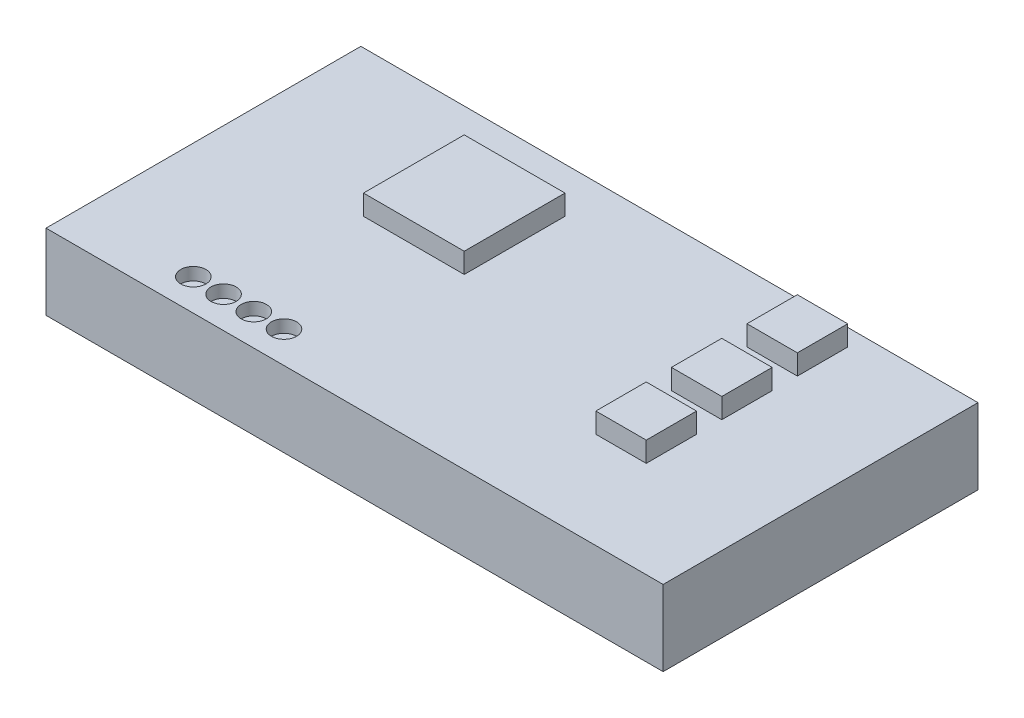
ISO-10303-21;
HEADER;
FILE_DESCRIPTION(('STEP AP214'),'2;1');
FILE_NAME('part.step','',(''),(''),'','','');
FILE_SCHEMA(('AUTOMOTIVE_DESIGN { 1 0 10303 214 1 1 1 1 }'));
ENDSEC;
DATA;
#1=APPLICATION_CONTEXT('core data for automotive mechanical design processes');
#2=APPLICATION_PROTOCOL_DEFINITION('international standard','automotive_design',2000,#1);
#3=PRODUCT_CONTEXT('',#1,'mechanical');
#4=PRODUCT('Part','Part','',(#3));
#5=PRODUCT_RELATED_PRODUCT_CATEGORY('part','',(#4));
#6=PRODUCT_DEFINITION_FORMATION('','',#4);
#7=PRODUCT_DEFINITION_CONTEXT('part definition',#1,'design');
#8=PRODUCT_DEFINITION('design','',#6,#7);
#9=PRODUCT_DEFINITION_SHAPE('','',#8);
#10=(LENGTH_UNIT() NAMED_UNIT(*) SI_UNIT(.MILLI.,.METRE.));
#11=(NAMED_UNIT(*) PLANE_ANGLE_UNIT() SI_UNIT($,.RADIAN.));
#12=(NAMED_UNIT(*) SI_UNIT($,.STERADIAN.) SOLID_ANGLE_UNIT());
#13=UNCERTAINTY_MEASURE_WITH_UNIT(LENGTH_MEASURE(1.E-05),#10,'distance_accuracy_value','');
#14=(GEOMETRIC_REPRESENTATION_CONTEXT(3) GLOBAL_UNCERTAINTY_ASSIGNED_CONTEXT((#13)) GLOBAL_UNIT_ASSIGNED_CONTEXT((#10,
#11,#12)) REPRESENTATION_CONTEXT('',''));
#15=CARTESIAN_POINT('',(0.,0.,0.));
#16=DIRECTION('',(0.,0.,1.));
#17=DIRECTION('',(1.,0.,0.));
#18=AXIS2_PLACEMENT_3D('',#15,#16,#17);
#19=CARTESIAN_POINT('',(0.,3.,0.));
#20=DIRECTION('',(0.,1.,0.));
#21=DIRECTION('',(0.,0.,1.));
#22=AXIS2_PLACEMENT_3D('',#19,#20,#21);
#23=PLANE('',#22);
#24=CARTESIAN_POINT('',(-6.45486952116644,3.,4.99629776021628));
#25=DIRECTION('',(0.,1.,0.));
#26=DIRECTION('',(0.,0.,1.));
#27=AXIS2_PLACEMENT_3D('',#24,#25,#26);
#28=CIRCLE('',#27,0.500000000000002);
#29=CARTESIAN_POINT('',(-6.45486952116644,3.,5.49629776021629));
#30=VERTEX_POINT('',#29);
#31=EDGE_CURVE('E290',#30,#30,#28,.T.);
#32=ORIENTED_EDGE('',*,*,#31,.F.);
#33=EDGE_LOOP('',(#32));
#34=FACE_BOUND('',#33,.T.);
#35=CARTESIAN_POINT('',(-5.25486952116644,3.,4.99629776021628));
#36=DIRECTION('',(0.,1.,0.));
#37=DIRECTION('',(0.,0.,1.));
#38=AXIS2_PLACEMENT_3D('',#35,#36,#37);
#39=CIRCLE('',#38,0.500000000000001);
#40=CARTESIAN_POINT('',(-5.25486952116644,3.,5.49629776021629));
#41=VERTEX_POINT('',#40);
#42=EDGE_CURVE('E296',#41,#41,#39,.T.);
#43=ORIENTED_EDGE('',*,*,#42,.F.);
#44=EDGE_LOOP('',(#43));
#45=FACE_BOUND('',#44,.T.);
#46=CARTESIAN_POINT('',(-4.05486952116644,3.,4.99629776021628));
#47=DIRECTION('',(0.,1.,0.));
#48=DIRECTION('',(0.,0.,1.));
#49=AXIS2_PLACEMENT_3D('',#46,#47,#48);
#50=CIRCLE('',#49,0.500000000000001);
#51=CARTESIAN_POINT('',(-4.05486952116644,3.,5.49629776021629));
#52=VERTEX_POINT('',#51);
#53=EDGE_CURVE('E285',#52,#52,#50,.T.);
#54=ORIENTED_EDGE('',*,*,#53,.F.);
#55=EDGE_LOOP('',(#54));
#56=FACE_BOUND('',#55,.T.);
#57=CARTESIAN_POINT('',(-7.65486952116644,3.,4.99629776021628));
#58=DIRECTION('',(0.,1.,0.));
#59=DIRECTION('',(0.,0.,1.));
#60=AXIS2_PLACEMENT_3D('',#57,#58,#59);
#61=CIRCLE('',#60,0.500000000000001);
#62=CARTESIAN_POINT('',(-7.65486952116644,3.,5.49629776021629));
#63=VERTEX_POINT('',#62);
#64=EDGE_CURVE('E289',#63,#63,#61,.T.);
#65=ORIENTED_EDGE('',*,*,#64,.F.);
#66=EDGE_LOOP('',(#65));
#67=FACE_BOUND('',#66,.T.);
#68=DIRECTION('',(0.,0.,-1.));
#69=VECTOR('',#68,1.);
#70=CARTESIAN_POINT('',(12.25,3.,-6.25));
#71=LINE('',#70,#69);
#72=CARTESIAN_POINT('',(12.25,3.,6.25));
#73=VERTEX_POINT('',#72);
#74=CARTESIAN_POINT('',(12.25,3.,-6.25));
#75=VERTEX_POINT('',#74);
#76=EDGE_CURVE('E310',#73,#75,#71,.T.);
#77=ORIENTED_EDGE('',*,*,#76,.T.);
#78=DIRECTION('',(-1.,0.,0.));
#79=VECTOR('',#78,1.);
#80=CARTESIAN_POINT('',(-12.25,3.,-6.25));
#81=LINE('',#80,#79);
#82=CARTESIAN_POINT('',(-12.25,3.,-6.25));
#83=VERTEX_POINT('',#82);
#84=EDGE_CURVE('E313',#75,#83,#81,.T.);
#85=ORIENTED_EDGE('',*,*,#84,.T.);
#86=DIRECTION('',(0.,0.,1.));
#87=VECTOR('',#86,1.);
#88=CARTESIAN_POINT('',(-12.25,3.,-6.25));
#89=LINE('',#88,#87);
#90=CARTESIAN_POINT('',(-12.25,3.,6.25));
#91=VERTEX_POINT('',#90);
#92=EDGE_CURVE('E316',#83,#91,#89,.T.);
#93=ORIENTED_EDGE('',*,*,#92,.T.);
#94=DIRECTION('',(1.,0.,0.));
#95=VECTOR('',#94,1.);
#96=CARTESIAN_POINT('',(-12.25,3.,6.25));
#97=LINE('',#96,#95);
#98=EDGE_CURVE('E318',#91,#73,#97,.T.);
#99=ORIENTED_EDGE('',*,*,#98,.T.);
#100=EDGE_LOOP('',(#77,#85,#93,#99));
#101=FACE_BOUND('',#100,.T.);
#102=DIRECTION('',(-1.,0.,0.));
#103=VECTOR('',#102,1.);
#104=CARTESIAN_POINT('',(-6.35384151580184,3.,-4.45761794479129));
#105=LINE('',#104,#103);
#106=CARTESIAN_POINT('',(-2.35384151580184,3.,-4.45761794479129));
#107=VERTEX_POINT('',#106);
#108=CARTESIAN_POINT('',(-6.35384151580184,3.,-4.45761794479129));
#109=VERTEX_POINT('',#108);
#110=EDGE_CURVE('E270',#107,#109,#105,.T.);
#111=ORIENTED_EDGE('',*,*,#110,.F.);
#112=DIRECTION('',(0.,0.,-1.));
#113=VECTOR('',#112,1.);
#114=CARTESIAN_POINT('',(-2.35384151580184,3.,-4.45761794479129));
#115=LINE('',#114,#113);
#116=CARTESIAN_POINT('',(-2.35384151580184,3.,-0.457617944791294));
#117=VERTEX_POINT('',#116);
#118=EDGE_CURVE('E256',#117,#107,#115,.T.);
#119=ORIENTED_EDGE('',*,*,#118,.F.);
#120=DIRECTION('',(1.,0.,0.));
#121=VECTOR('',#120,1.);
#122=CARTESIAN_POINT('',(-6.35384151580184,3.,-0.457617944791294));
#123=LINE('',#122,#121);
#124=CARTESIAN_POINT('',(-6.35384151580184,3.,-0.457617944791294));
#125=VERTEX_POINT('',#124);
#126=EDGE_CURVE('E261',#125,#117,#123,.T.);
#127=ORIENTED_EDGE('',*,*,#126,.F.);
#128=DIRECTION('',(0.,0.,1.));
#129=VECTOR('',#128,1.);
#130=CARTESIAN_POINT('',(-6.35384151580184,3.,-4.45761794479129));
#131=LINE('',#130,#129);
#132=EDGE_CURVE('E272',#109,#125,#131,.T.);
#133=ORIENTED_EDGE('',*,*,#132,.F.);
#134=EDGE_LOOP('',(#111,#119,#127,#133));
#135=FACE_BOUND('',#134,.T.);
#136=DIRECTION('',(-1.,0.,0.));
#137=VECTOR('',#136,1.);
#138=CARTESIAN_POINT('',(5.75248587462615,3.,-5.57459680159975));
#139=LINE('',#138,#137);
#140=CARTESIAN_POINT('',(7.75248587462615,3.,-5.57459680159975));
#141=VERTEX_POINT('',#140);
#142=CARTESIAN_POINT('',(5.75248587462615,3.,-5.57459680159975));
#143=VERTEX_POINT('',#142);
#144=EDGE_CURVE('E241',#141,#143,#139,.T.);
#145=ORIENTED_EDGE('',*,*,#144,.F.);
#146=DIRECTION('',(0.,0.,-1.));
#147=VECTOR('',#146,1.);
#148=CARTESIAN_POINT('',(7.75248587462615,3.,-5.57459680159975));
#149=LINE('',#148,#147);
#150=CARTESIAN_POINT('',(7.75248587462615,3.,-3.57653343185074));
#151=VERTEX_POINT('',#150);
#152=EDGE_CURVE('E227',#151,#141,#149,.T.);
#153=ORIENTED_EDGE('',*,*,#152,.F.);
#154=DIRECTION('',(1.,0.,0.));
#155=VECTOR('',#154,1.);
#156=CARTESIAN_POINT('',(5.75248587462615,3.,-3.57653343185074));
#157=LINE('',#156,#155);
#158=CARTESIAN_POINT('',(5.75248587462615,3.,-3.57653343185074));
#159=VERTEX_POINT('',#158);
#160=EDGE_CURVE('E232',#159,#151,#157,.T.);
#161=ORIENTED_EDGE('',*,*,#160,.F.);
#162=DIRECTION('',(0.,0.,1.));
#163=VECTOR('',#162,1.);
#164=CARTESIAN_POINT('',(5.75248587462615,3.,-5.57459680159975));
#165=LINE('',#164,#163);
#166=EDGE_CURVE('E243',#143,#159,#165,.T.);
#167=ORIENTED_EDGE('',*,*,#166,.F.);
#168=EDGE_LOOP('',(#145,#153,#161,#167));
#169=FACE_BOUND('',#168,.T.);
#170=DIRECTION('',(-1.,0.,0.));
#171=VECTOR('',#170,1.);
#172=CARTESIAN_POINT('',(5.75248587462618,3.,-2.57459680159975));
#173=LINE('',#172,#171);
#174=CARTESIAN_POINT('',(7.75248587462618,3.,-2.57459680159975));
#175=VERTEX_POINT('',#174);
#176=CARTESIAN_POINT('',(5.75248587462618,3.,-2.57459680159975));
#177=VERTEX_POINT('',#176);
#178=EDGE_CURVE('E199',#175,#177,#173,.T.);
#179=ORIENTED_EDGE('',*,*,#178,.F.);
#180=DIRECTION('',(0.,0.,-1.));
#181=VECTOR('',#180,1.);
#182=CARTESIAN_POINT('',(7.75248587462618,3.,-2.57459680159975));
#183=LINE('',#182,#181);
#184=CARTESIAN_POINT('',(7.75248587462618,3.,-0.576533431850738));
#185=VERTEX_POINT('',#184);
#186=EDGE_CURVE('E196',#185,#175,#183,.T.);
#187=ORIENTED_EDGE('',*,*,#186,.F.);
#188=DIRECTION('',(1.,0.,0.));
#189=VECTOR('',#188,1.);
#190=CARTESIAN_POINT('',(5.75248587462618,3.,-0.576533431850738));
#191=LINE('',#190,#189);
#192=CARTESIAN_POINT('',(5.75248587462618,3.,-0.576533431850738));
#193=VERTEX_POINT('',#192);
#194=EDGE_CURVE('E208',#193,#185,#191,.T.);
#195=ORIENTED_EDGE('',*,*,#194,.F.);
#196=DIRECTION('',(0.,0.,1.));
#197=VECTOR('',#196,1.);
#198=CARTESIAN_POINT('',(5.75248587462618,3.,-2.57459680159975));
#199=LINE('',#198,#197);
#200=EDGE_CURVE('E216',#177,#193,#199,.T.);
#201=ORIENTED_EDGE('',*,*,#200,.F.);
#202=EDGE_LOOP('',(#179,#187,#195,#201));
#203=FACE_BOUND('',#202,.T.);
#204=DIRECTION('',(-1.,0.,0.));
#205=VECTOR('',#204,1.);
#206=CARTESIAN_POINT('',(5.75248587462622,3.,0.425403198400254));
#207=LINE('',#206,#205);
#208=CARTESIAN_POINT('',(7.75248587462622,3.,0.425403198400254));
#209=VERTEX_POINT('',#208);
#210=CARTESIAN_POINT('',(5.75248587462622,3.,0.425403198400254));
#211=VERTEX_POINT('',#210);
#212=EDGE_CURVE('E682',#209,#211,#207,.T.);
#213=ORIENTED_EDGE('',*,*,#212,.F.);
#214=DIRECTION('',(0.,0.,-1.));
#215=VECTOR('',#214,1.);
#216=CARTESIAN_POINT('',(7.75248587462622,3.,0.425403198400254));
#217=LINE('',#216,#215);
#218=CARTESIAN_POINT('',(7.75248587462622,3.,2.42346656814926));
#219=VERTEX_POINT('',#218);
#220=EDGE_CURVE('E194',#219,#209,#217,.T.);
#221=ORIENTED_EDGE('',*,*,#220,.F.);
#222=DIRECTION('',(1.,0.,0.));
#223=VECTOR('',#222,1.);
#224=CARTESIAN_POINT('',(5.75248587462622,3.,2.42346656814926));
#225=LINE('',#224,#223);
#226=CARTESIAN_POINT('',(5.75248587462622,3.,2.42346656814926));
#227=VERTEX_POINT('',#226);
#228=EDGE_CURVE('E190',#227,#219,#225,.T.);
#229=ORIENTED_EDGE('',*,*,#228,.F.);
#230=DIRECTION('',(0.,0.,1.));
#231=VECTOR('',#230,1.);
#232=CARTESIAN_POINT('',(5.75248587462622,3.,0.425403198400254));
#233=LINE('',#232,#231);
#234=EDGE_CURVE('E679',#211,#227,#233,.T.);
#235=ORIENTED_EDGE('',*,*,#234,.F.);
#236=EDGE_LOOP('',(#213,#221,#229,#235));
#237=FACE_BOUND('',#236,.T.);
#238=ADVANCED_FACE('F33',(#34,#45,#56,#67,#101,#135,#169,#203,#237),#23,.T.);
#239=CARTESIAN_POINT('',(12.25,3.,-6.25));
#240=DIRECTION('',(-1.,0.,0.));
#241=DIRECTION('',(0.,0.,1.));
#242=AXIS2_PLACEMENT_3D('',#239,#240,#241);
#243=PLANE('',#242);
#244=DIRECTION('',(0.,0.,-1.));
#245=VECTOR('',#244,1.);
#246=CARTESIAN_POINT('',(12.25,0.,-6.25));
#247=LINE('',#246,#245);
#248=CARTESIAN_POINT('',(12.25,0.,6.25));
#249=VERTEX_POINT('',#248);
#250=CARTESIAN_POINT('',(12.25,0.,-6.25));
#251=VERTEX_POINT('',#250);
#252=EDGE_CURVE('E307',#249,#251,#247,.T.);
#253=ORIENTED_EDGE('',*,*,#252,.T.);
#254=DIRECTION('',(0.,-1.,0.));
#255=VECTOR('',#254,1.);
#256=CARTESIAN_POINT('',(12.25,3.,-6.25));
#257=LINE('',#256,#255);
#258=EDGE_CURVE('E11',#75,#251,#257,.T.);
#259=ORIENTED_EDGE('',*,*,#258,.F.);
#260=ORIENTED_EDGE('',*,*,#76,.F.);
#261=DIRECTION('',(0.,-1.,0.));
#262=VECTOR('',#261,1.);
#263=CARTESIAN_POINT('',(12.25,3.,6.25));
#264=LINE('',#263,#262);
#265=EDGE_CURVE('E320',#73,#249,#264,.T.);
#266=ORIENTED_EDGE('',*,*,#265,.T.);
#267=EDGE_LOOP('',(#253,#259,#260,#266));
#268=FACE_BOUND('',#267,.T.);
#269=ADVANCED_FACE('F35',(#268),#243,.F.);
#270=CARTESIAN_POINT('',(-12.25,3.,-6.25));
#271=DIRECTION('',(0.,0.,1.));
#272=DIRECTION('',(1.,0.,0.));
#273=AXIS2_PLACEMENT_3D('',#270,#271,#272);
#274=PLANE('',#273);
#275=DIRECTION('',(-1.,0.,0.));
#276=VECTOR('',#275,1.);
#277=CARTESIAN_POINT('',(-12.25,0.,-6.25));
#278=LINE('',#277,#276);
#279=CARTESIAN_POINT('',(-12.25,0.,-6.25));
#280=VERTEX_POINT('',#279);
#281=EDGE_CURVE('E323',#251,#280,#278,.T.);
#282=ORIENTED_EDGE('',*,*,#281,.T.);
#283=DIRECTION('',(0.,-1.,0.));
#284=VECTOR('',#283,1.);
#285=CARTESIAN_POINT('',(-12.25,3.,-6.25));
#286=LINE('',#285,#284);
#287=EDGE_CURVE('E41',#83,#280,#286,.T.);
#288=ORIENTED_EDGE('',*,*,#287,.F.);
#289=ORIENTED_EDGE('',*,*,#84,.F.);
#290=ORIENTED_EDGE('',*,*,#258,.T.);
#291=EDGE_LOOP('',(#282,#288,#289,#290));
#292=FACE_BOUND('',#291,.T.);
#293=ADVANCED_FACE('F353',(#292),#274,.F.);
#294=CARTESIAN_POINT('',(-12.25,3.,-6.25));
#295=DIRECTION('',(1.,0.,0.));
#296=DIRECTION('',(0.,0.,-1.));
#297=AXIS2_PLACEMENT_3D('',#294,#295,#296);
#298=PLANE('',#297);
#299=DIRECTION('',(0.,0.,1.));
#300=VECTOR('',#299,1.);
#301=CARTESIAN_POINT('',(-12.25,0.,-6.25));
#302=LINE('',#301,#300);
#303=CARTESIAN_POINT('',(-12.25,0.,6.25));
#304=VERTEX_POINT('',#303);
#305=EDGE_CURVE('E325',#280,#304,#302,.T.);
#306=ORIENTED_EDGE('',*,*,#305,.T.);
#307=DIRECTION('',(0.,-1.,0.));
#308=VECTOR('',#307,1.);
#309=CARTESIAN_POINT('',(-12.25,3.,6.25));
#310=LINE('',#309,#308);
#311=EDGE_CURVE('E330',#91,#304,#310,.T.);
#312=ORIENTED_EDGE('',*,*,#311,.F.);
#313=ORIENTED_EDGE('',*,*,#92,.F.);
#314=ORIENTED_EDGE('',*,*,#287,.T.);
#315=EDGE_LOOP('',(#306,#312,#313,#314));
#316=FACE_BOUND('',#315,.T.);
#317=ADVANCED_FACE('F337',(#316),#298,.F.);
#318=CARTESIAN_POINT('',(-12.25,3.,6.25));
#319=DIRECTION('',(0.,0.,-1.));
#320=DIRECTION('',(-1.,0.,0.));
#321=AXIS2_PLACEMENT_3D('',#318,#319,#320);
#322=PLANE('',#321);
#323=DIRECTION('',(1.,0.,0.));
#324=VECTOR('',#323,1.);
#325=CARTESIAN_POINT('',(-12.25,0.,6.25));
#326=LINE('',#325,#324);
#327=EDGE_CURVE('E314',#304,#249,#326,.T.);
#328=ORIENTED_EDGE('',*,*,#327,.T.);
#329=ORIENTED_EDGE('',*,*,#265,.F.);
#330=ORIENTED_EDGE('',*,*,#98,.F.);
#331=ORIENTED_EDGE('',*,*,#311,.T.);
#332=EDGE_LOOP('',(#328,#329,#330,#331));
#333=FACE_BOUND('',#332,.T.);
#334=ADVANCED_FACE('F346',(#333),#322,.F.);
#335=CARTESIAN_POINT('',(0.,0.,0.));
#336=DIRECTION('',(0.,1.,0.));
#337=DIRECTION('',(0.,0.,1.));
#338=AXIS2_PLACEMENT_3D('',#335,#336,#337);
#339=PLANE('',#338);
#340=ORIENTED_EDGE('',*,*,#252,.F.);
#341=ORIENTED_EDGE('',*,*,#327,.F.);
#342=ORIENTED_EDGE('',*,*,#305,.F.);
#343=ORIENTED_EDGE('',*,*,#281,.F.);
#344=EDGE_LOOP('',(#340,#341,#342,#343));
#345=FACE_BOUND('',#344,.T.);
#346=ADVANCED_FACE('F343',(#345),#339,.F.);
#347=CARTESIAN_POINT('',(-7.65486952116644,2.5,4.99629776021628));
#348=DIRECTION('',(0.,1.,0.));
#349=DIRECTION('',(0.,0.,1.));
#350=AXIS2_PLACEMENT_3D('',#347,#348,#349);
#351=CYLINDRICAL_SURFACE('',#350,0.500000000000001);
#352=CARTESIAN_POINT('',(-7.65486952116644,2.5,4.99629776021628));
#353=DIRECTION('',(0.,1.,0.));
#354=DIRECTION('',(0.,0.,1.));
#355=AXIS2_PLACEMENT_3D('',#352,#353,#354);
#356=CIRCLE('',#355,0.500000000000001);
#357=CARTESIAN_POINT('',(-7.65486952116644,2.5,5.49629776021629));
#358=VERTEX_POINT('',#357);
#359=EDGE_CURVE('E304',#358,#358,#356,.T.);
#360=ORIENTED_EDGE('',*,*,#359,.F.);
#361=EDGE_LOOP('',(#360));
#362=FACE_BOUND('',#361,.T.);
#363=ORIENTED_EDGE('',*,*,#64,.T.);
#364=EDGE_LOOP('',(#363));
#365=FACE_BOUND('',#364,.T.);
#366=ADVANCED_FACE('F369',(#362,#365),#351,.F.);
#367=CARTESIAN_POINT('',(-7.65486952116644,2.5,4.99629776021628));
#368=DIRECTION('',(0.,1.,0.));
#369=DIRECTION('',(0.,0.,1.));
#370=AXIS2_PLACEMENT_3D('',#367,#368,#369);
#371=PLANE('',#370);
#372=ORIENTED_EDGE('',*,*,#359,.T.);
#373=EDGE_LOOP('',(#372));
#374=FACE_BOUND('',#373,.T.);
#375=ADVANCED_FACE('F388',(#374),#371,.T.);
#376=CARTESIAN_POINT('',(-4.05486952116644,2.5,4.99629776021628));
#377=DIRECTION('',(0.,1.,0.));
#378=DIRECTION('',(0.,0.,1.));
#379=AXIS2_PLACEMENT_3D('',#376,#377,#378);
#380=CYLINDRICAL_SURFACE('',#379,0.500000000000001);
#381=CARTESIAN_POINT('',(-4.05486952116644,2.5,4.99629776021628));
#382=DIRECTION('',(0.,1.,0.));
#383=DIRECTION('',(0.,0.,1.));
#384=AXIS2_PLACEMENT_3D('',#381,#382,#383);
#385=CIRCLE('',#384,0.500000000000001);
#386=CARTESIAN_POINT('',(-4.05486952116644,2.5,5.49629776021629));
#387=VERTEX_POINT('',#386);
#388=EDGE_CURVE('E299',#387,#387,#385,.T.);
#389=ORIENTED_EDGE('',*,*,#388,.F.);
#390=EDGE_LOOP('',(#389));
#391=FACE_BOUND('',#390,.T.);
#392=ORIENTED_EDGE('',*,*,#53,.T.);
#393=EDGE_LOOP('',(#392));
#394=FACE_BOUND('',#393,.T.);
#395=ADVANCED_FACE('F395',(#391,#394),#380,.F.);
#396=CARTESIAN_POINT('',(-4.05486952116644,2.5,4.99629776021628));
#397=DIRECTION('',(0.,1.,0.));
#398=DIRECTION('',(0.,0.,1.));
#399=AXIS2_PLACEMENT_3D('',#396,#397,#398);
#400=PLANE('',#399);
#401=ORIENTED_EDGE('',*,*,#388,.T.);
#402=EDGE_LOOP('',(#401));
#403=FACE_BOUND('',#402,.T.);
#404=ADVANCED_FACE('F402',(#403),#400,.T.);
#405=CARTESIAN_POINT('',(-5.25486952116644,2.5,4.99629776021628));
#406=DIRECTION('',(0.,1.,0.));
#407=DIRECTION('',(0.,0.,1.));
#408=AXIS2_PLACEMENT_3D('',#405,#406,#407);
#409=CYLINDRICAL_SURFACE('',#408,0.500000000000001);
#410=CARTESIAN_POINT('',(-5.25486952116644,2.5,4.99629776021628));
#411=DIRECTION('',(0.,1.,0.));
#412=DIRECTION('',(0.,0.,1.));
#413=AXIS2_PLACEMENT_3D('',#410,#411,#412);
#414=CIRCLE('',#413,0.500000000000001);
#415=CARTESIAN_POINT('',(-5.25486952116644,2.5,5.49629776021629));
#416=VERTEX_POINT('',#415);
#417=EDGE_CURVE('E293',#416,#416,#414,.T.);
#418=ORIENTED_EDGE('',*,*,#417,.F.);
#419=EDGE_LOOP('',(#418));
#420=FACE_BOUND('',#419,.T.);
#421=ORIENTED_EDGE('',*,*,#42,.T.);
#422=EDGE_LOOP('',(#421));
#423=FACE_BOUND('',#422,.T.);
#424=ADVANCED_FACE('F410',(#420,#423),#409,.F.);
#425=CARTESIAN_POINT('',(-5.25486952116644,2.5,4.99629776021628));
#426=DIRECTION('',(0.,1.,0.));
#427=DIRECTION('',(0.,0.,1.));
#428=AXIS2_PLACEMENT_3D('',#425,#426,#427);
#429=PLANE('',#428);
#430=ORIENTED_EDGE('',*,*,#417,.T.);
#431=EDGE_LOOP('',(#430));
#432=FACE_BOUND('',#431,.T.);
#433=ADVANCED_FACE('F418',(#432),#429,.T.);
#434=CARTESIAN_POINT('',(-6.45486952116644,2.5,4.99629776021628));
#435=DIRECTION('',(0.,1.,0.));
#436=DIRECTION('',(0.,0.,1.));
#437=AXIS2_PLACEMENT_3D('',#434,#435,#436);
#438=CYLINDRICAL_SURFACE('',#437,0.500000000000002);
#439=CARTESIAN_POINT('',(-6.45486952116644,2.5,4.99629776021628));
#440=DIRECTION('',(0.,1.,0.));
#441=DIRECTION('',(0.,0.,1.));
#442=AXIS2_PLACEMENT_3D('',#439,#440,#441);
#443=CIRCLE('',#442,0.500000000000002);
#444=CARTESIAN_POINT('',(-6.45486952116644,2.5,5.49629776021629));
#445=VERTEX_POINT('',#444);
#446=EDGE_CURVE('E286',#445,#445,#443,.T.);
#447=ORIENTED_EDGE('',*,*,#446,.F.);
#448=EDGE_LOOP('',(#447));
#449=FACE_BOUND('',#448,.T.);
#450=ORIENTED_EDGE('',*,*,#31,.T.);
#451=EDGE_LOOP('',(#450));
#452=FACE_BOUND('',#451,.T.);
#453=ADVANCED_FACE('F426',(#449,#452),#438,.F.);
#454=CARTESIAN_POINT('',(-6.45486952116644,2.5,4.99629776021628));
#455=DIRECTION('',(0.,1.,0.));
#456=DIRECTION('',(0.,0.,1.));
#457=AXIS2_PLACEMENT_3D('',#454,#455,#456);
#458=PLANE('',#457);
#459=ORIENTED_EDGE('',*,*,#446,.T.);
#460=EDGE_LOOP('',(#459));
#461=FACE_BOUND('',#460,.T.);
#462=ADVANCED_FACE('F434',(#461),#458,.T.);
#463=CARTESIAN_POINT('',(-2.35384151580184,3.8,-4.45761794479129));
#464=DIRECTION('',(-1.,0.,0.));
#465=DIRECTION('',(0.,0.,1.));
#466=AXIS2_PLACEMENT_3D('',#463,#464,#465);
#467=PLANE('',#466);
#468=ORIENTED_EDGE('',*,*,#118,.T.);
#469=DIRECTION('',(0.,-1.,0.));
#470=VECTOR('',#469,1.);
#471=CARTESIAN_POINT('',(-2.35384151580184,3.8,-4.45761794479129));
#472=LINE('',#471,#470);
#473=CARTESIAN_POINT('',(-2.35384151580184,3.8,-4.45761794479129));
#474=VERTEX_POINT('',#473);
#475=EDGE_CURVE('E283',#474,#107,#472,.T.);
#476=ORIENTED_EDGE('',*,*,#475,.F.);
#477=DIRECTION('',(0.,0.,-1.));
#478=VECTOR('',#477,1.);
#479=CARTESIAN_POINT('',(-2.35384151580184,3.8,-4.45761794479129));
#480=LINE('',#479,#478);
#481=CARTESIAN_POINT('',(-2.35384151580184,3.8,-0.457617944791294));
#482=VERTEX_POINT('',#481);
#483=EDGE_CURVE('E257',#482,#474,#480,.T.);
#484=ORIENTED_EDGE('',*,*,#483,.F.);
#485=DIRECTION('',(0.,-1.,0.));
#486=VECTOR('',#485,1.);
#487=CARTESIAN_POINT('',(-2.35384151580184,3.8,-0.457617944791294));
#488=LINE('',#487,#486);
#489=EDGE_CURVE('E267',#482,#117,#488,.T.);
#490=ORIENTED_EDGE('',*,*,#489,.T.);
#491=EDGE_LOOP('',(#468,#476,#484,#490));
#492=FACE_BOUND('',#491,.T.);
#493=ADVANCED_FACE('F442',(#492),#467,.F.);
#494=CARTESIAN_POINT('',(-6.35384151580184,3.8,-4.45761794479129));
#495=DIRECTION('',(0.,0.,1.));
#496=DIRECTION('',(1.,0.,0.));
#497=AXIS2_PLACEMENT_3D('',#494,#495,#496);
#498=PLANE('',#497);
#499=ORIENTED_EDGE('',*,*,#110,.T.);
#500=DIRECTION('',(0.,-1.,0.));
#501=VECTOR('',#500,1.);
#502=CARTESIAN_POINT('',(-6.35384151580184,3.8,-4.45761794479129));
#503=LINE('',#502,#501);
#504=CARTESIAN_POINT('',(-6.35384151580184,3.8,-4.45761794479129));
#505=VERTEX_POINT('',#504);
#506=EDGE_CURVE('E280',#505,#109,#503,.T.);
#507=ORIENTED_EDGE('',*,*,#506,.F.);
#508=DIRECTION('',(-1.,0.,0.));
#509=VECTOR('',#508,1.);
#510=CARTESIAN_POINT('',(-6.35384151580184,3.8,-4.45761794479129));
#511=LINE('',#510,#509);
#512=EDGE_CURVE('E260',#474,#505,#511,.T.);
#513=ORIENTED_EDGE('',*,*,#512,.F.);
#514=ORIENTED_EDGE('',*,*,#475,.T.);
#515=EDGE_LOOP('',(#499,#507,#513,#514));
#516=FACE_BOUND('',#515,.T.);
#517=ADVANCED_FACE('F450',(#516),#498,.F.);
#518=CARTESIAN_POINT('',(-6.35384151580184,3.8,-4.45761794479129));
#519=DIRECTION('',(1.,0.,0.));
#520=DIRECTION('',(0.,0.,-1.));
#521=AXIS2_PLACEMENT_3D('',#518,#519,#520);
#522=PLANE('',#521);
#523=ORIENTED_EDGE('',*,*,#132,.T.);
#524=DIRECTION('',(0.,-1.,0.));
#525=VECTOR('',#524,1.);
#526=CARTESIAN_POINT('',(-6.35384151580184,3.8,-0.457617944791294));
#527=LINE('',#526,#525);
#528=CARTESIAN_POINT('',(-6.35384151580184,3.8,-0.457617944791294));
#529=VERTEX_POINT('',#528);
#530=EDGE_CURVE('E278',#529,#125,#527,.T.);
#531=ORIENTED_EDGE('',*,*,#530,.F.);
#532=DIRECTION('',(0.,0.,1.));
#533=VECTOR('',#532,1.);
#534=CARTESIAN_POINT('',(-6.35384151580184,3.8,-4.45761794479129));
#535=LINE('',#534,#533);
#536=EDGE_CURVE('E263',#505,#529,#535,.T.);
#537=ORIENTED_EDGE('',*,*,#536,.F.);
#538=ORIENTED_EDGE('',*,*,#506,.T.);
#539=EDGE_LOOP('',(#523,#531,#537,#538));
#540=FACE_BOUND('',#539,.T.);
#541=ADVANCED_FACE('F458',(#540),#522,.F.);
#542=CARTESIAN_POINT('',(-6.35384151580184,3.8,-0.457617944791294));
#543=DIRECTION('',(0.,0.,-1.));
#544=DIRECTION('',(-1.,0.,0.));
#545=AXIS2_PLACEMENT_3D('',#542,#543,#544);
#546=PLANE('',#545);
#547=ORIENTED_EDGE('',*,*,#126,.T.);
#548=ORIENTED_EDGE('',*,*,#489,.F.);
#549=DIRECTION('',(1.,0.,0.));
#550=VECTOR('',#549,1.);
#551=CARTESIAN_POINT('',(-6.35384151580184,3.8,-0.457617944791294));
#552=LINE('',#551,#550);
#553=EDGE_CURVE('E265',#529,#482,#552,.T.);
#554=ORIENTED_EDGE('',*,*,#553,.F.);
#555=ORIENTED_EDGE('',*,*,#530,.T.);
#556=EDGE_LOOP('',(#547,#548,#554,#555));
#557=FACE_BOUND('',#556,.T.);
#558=ADVANCED_FACE('F466',(#557),#546,.F.);
#559=CARTESIAN_POINT('',(0.,3.8,0.));
#560=DIRECTION('',(0.,1.,0.));
#561=DIRECTION('',(0.,0.,1.));
#562=AXIS2_PLACEMENT_3D('',#559,#560,#561);
#563=PLANE('',#562);
#564=ORIENTED_EDGE('',*,*,#483,.T.);
#565=ORIENTED_EDGE('',*,*,#512,.T.);
#566=ORIENTED_EDGE('',*,*,#536,.T.);
#567=ORIENTED_EDGE('',*,*,#553,.T.);
#568=EDGE_LOOP('',(#564,#565,#566,#567));
#569=FACE_BOUND('',#568,.T.);
#570=ADVANCED_FACE('F474',(#569),#563,.T.);
#571=CARTESIAN_POINT('',(7.75248587462615,3.8,-5.57459680159975));
#572=DIRECTION('',(-1.,0.,0.));
#573=DIRECTION('',(0.,0.,1.));
#574=AXIS2_PLACEMENT_3D('',#571,#572,#573);
#575=PLANE('',#574);
#576=ORIENTED_EDGE('',*,*,#152,.T.);
#577=DIRECTION('',(0.,-1.,0.));
#578=VECTOR('',#577,1.);
#579=CARTESIAN_POINT('',(7.75248587462615,3.8,-5.57459680159975));
#580=LINE('',#579,#578);
#581=CARTESIAN_POINT('',(7.75248587462615,3.8,-5.57459680159975));
#582=VERTEX_POINT('',#581);
#583=EDGE_CURVE('E254',#582,#141,#580,.T.);
#584=ORIENTED_EDGE('',*,*,#583,.F.);
#585=DIRECTION('',(0.,0.,-1.));
#586=VECTOR('',#585,1.);
#587=CARTESIAN_POINT('',(7.75248587462615,3.8,-5.57459680159975));
#588=LINE('',#587,#586);
#589=CARTESIAN_POINT('',(7.75248587462615,3.8,-3.57653343185074));
#590=VERTEX_POINT('',#589);
#591=EDGE_CURVE('E228',#590,#582,#588,.T.);
#592=ORIENTED_EDGE('',*,*,#591,.F.);
#593=DIRECTION('',(0.,-1.,0.));
#594=VECTOR('',#593,1.);
#595=CARTESIAN_POINT('',(7.75248587462615,3.8,-3.57653343185074));
#596=LINE('',#595,#594);
#597=EDGE_CURVE('E238',#590,#151,#596,.T.);
#598=ORIENTED_EDGE('',*,*,#597,.T.);
#599=EDGE_LOOP('',(#576,#584,#592,#598));
#600=FACE_BOUND('',#599,.T.);
#601=ADVANCED_FACE('F482',(#600),#575,.F.);
#602=CARTESIAN_POINT('',(5.75248587462615,3.8,-5.57459680159975));
#603=DIRECTION('',(0.,0.,1.));
#604=DIRECTION('',(1.,0.,0.));
#605=AXIS2_PLACEMENT_3D('',#602,#603,#604);
#606=PLANE('',#605);
#607=ORIENTED_EDGE('',*,*,#144,.T.);
#608=DIRECTION('',(0.,-1.,0.));
#609=VECTOR('',#608,1.);
#610=CARTESIAN_POINT('',(5.75248587462615,3.8,-5.57459680159975));
#611=LINE('',#610,#609);
#612=CARTESIAN_POINT('',(5.75248587462615,3.8,-5.57459680159975));
#613=VERTEX_POINT('',#612);
#614=EDGE_CURVE('E251',#613,#143,#611,.T.);
#615=ORIENTED_EDGE('',*,*,#614,.F.);
#616=DIRECTION('',(-1.,0.,0.));
#617=VECTOR('',#616,1.);
#618=CARTESIAN_POINT('',(5.75248587462615,3.8,-5.57459680159975));
#619=LINE('',#618,#617);
#620=EDGE_CURVE('E231',#582,#613,#619,.T.);
#621=ORIENTED_EDGE('',*,*,#620,.F.);
#622=ORIENTED_EDGE('',*,*,#583,.T.);
#623=EDGE_LOOP('',(#607,#615,#621,#622));
#624=FACE_BOUND('',#623,.T.);
#625=ADVANCED_FACE('F490',(#624),#606,.F.);
#626=CARTESIAN_POINT('',(5.75248587462615,3.8,-5.57459680159975));
#627=DIRECTION('',(1.,0.,0.));
#628=DIRECTION('',(0.,0.,-1.));
#629=AXIS2_PLACEMENT_3D('',#626,#627,#628);
#630=PLANE('',#629);
#631=ORIENTED_EDGE('',*,*,#166,.T.);
#632=DIRECTION('',(0.,-1.,0.));
#633=VECTOR('',#632,1.);
#634=CARTESIAN_POINT('',(5.75248587462615,3.8,-3.57653343185074));
#635=LINE('',#634,#633);
#636=CARTESIAN_POINT('',(5.75248587462615,3.8,-3.57653343185074));
#637=VERTEX_POINT('',#636);
#638=EDGE_CURVE('E249',#637,#159,#635,.T.);
#639=ORIENTED_EDGE('',*,*,#638,.F.);
#640=DIRECTION('',(0.,0.,1.));
#641=VECTOR('',#640,1.);
#642=CARTESIAN_POINT('',(5.75248587462615,3.8,-5.57459680159975));
#643=LINE('',#642,#641);
#644=EDGE_CURVE('E234',#613,#637,#643,.T.);
#645=ORIENTED_EDGE('',*,*,#644,.F.);
#646=ORIENTED_EDGE('',*,*,#614,.T.);
#647=EDGE_LOOP('',(#631,#639,#645,#646));
#648=FACE_BOUND('',#647,.T.);
#649=ADVANCED_FACE('F498',(#648),#630,.F.);
#650=CARTESIAN_POINT('',(5.75248587462615,3.8,-3.57653343185074));
#651=DIRECTION('',(0.,0.,-1.));
#652=DIRECTION('',(-1.,0.,0.));
#653=AXIS2_PLACEMENT_3D('',#650,#651,#652);
#654=PLANE('',#653);
#655=ORIENTED_EDGE('',*,*,#160,.T.);
#656=ORIENTED_EDGE('',*,*,#597,.F.);
#657=DIRECTION('',(1.,0.,0.));
#658=VECTOR('',#657,1.);
#659=CARTESIAN_POINT('',(5.75248587462615,3.8,-3.57653343185074));
#660=LINE('',#659,#658);
#661=EDGE_CURVE('E236',#637,#590,#660,.T.);
#662=ORIENTED_EDGE('',*,*,#661,.F.);
#663=ORIENTED_EDGE('',*,*,#638,.T.);
#664=EDGE_LOOP('',(#655,#656,#662,#663));
#665=FACE_BOUND('',#664,.T.);
#666=ADVANCED_FACE('F506',(#665),#654,.F.);
#667=CARTESIAN_POINT('',(0.,3.8,0.));
#668=DIRECTION('',(0.,1.,0.));
#669=DIRECTION('',(0.,0.,1.));
#670=AXIS2_PLACEMENT_3D('',#667,#668,#669);
#671=PLANE('',#670);
#672=ORIENTED_EDGE('',*,*,#591,.T.);
#673=ORIENTED_EDGE('',*,*,#620,.T.);
#674=ORIENTED_EDGE('',*,*,#644,.T.);
#675=ORIENTED_EDGE('',*,*,#661,.T.);
#676=EDGE_LOOP('',(#672,#673,#674,#675));
#677=FACE_BOUND('',#676,.T.);
#678=ADVANCED_FACE('F514',(#677),#671,.T.);
#679=CARTESIAN_POINT('',(7.75248587462618,3.8,-2.57459680159975));
#680=DIRECTION('',(-1.,0.,0.));
#681=DIRECTION('',(0.,0.,1.));
#682=AXIS2_PLACEMENT_3D('',#679,#680,#681);
#683=PLANE('',#682);
#684=ORIENTED_EDGE('',*,*,#186,.T.);
#685=DIRECTION('',(0.,-1.,0.));
#686=VECTOR('',#685,1.);
#687=CARTESIAN_POINT('',(7.75248587462618,3.8,-2.57459680159975));
#688=LINE('',#687,#686);
#689=CARTESIAN_POINT('',(7.75248587462618,3.8,-2.57459680159975));
#690=VERTEX_POINT('',#689);
#691=EDGE_CURVE('E225',#690,#175,#688,.T.);
#692=ORIENTED_EDGE('',*,*,#691,.F.);
#693=DIRECTION('',(0.,0.,-1.));
#694=VECTOR('',#693,1.);
#695=CARTESIAN_POINT('',(7.75248587462618,3.8,-2.57459680159975));
#696=LINE('',#695,#694);
#697=CARTESIAN_POINT('',(7.75248587462618,3.8,-0.576533431850738));
#698=VERTEX_POINT('',#697);
#699=EDGE_CURVE('E204',#698,#690,#696,.T.);
#700=ORIENTED_EDGE('',*,*,#699,.F.);
#701=DIRECTION('',(0.,-1.,0.));
#702=VECTOR('',#701,1.);
#703=CARTESIAN_POINT('',(7.75248587462618,3.8,-0.576533431850738));
#704=LINE('',#703,#702);
#705=EDGE_CURVE('E213',#698,#185,#704,.T.);
#706=ORIENTED_EDGE('',*,*,#705,.T.);
#707=EDGE_LOOP('',(#684,#692,#700,#706));
#708=FACE_BOUND('',#707,.T.);
#709=ADVANCED_FACE('F522',(#708),#683,.F.);
#710=CARTESIAN_POINT('',(5.75248587462618,3.8,-2.57459680159975));
#711=DIRECTION('',(0.,0.,1.));
#712=DIRECTION('',(1.,0.,0.));
#713=AXIS2_PLACEMENT_3D('',#710,#711,#712);
#714=PLANE('',#713);
#715=ORIENTED_EDGE('',*,*,#178,.T.);
#716=DIRECTION('',(0.,-1.,0.));
#717=VECTOR('',#716,1.);
#718=CARTESIAN_POINT('',(5.75248587462618,3.8,-2.57459680159975));
#719=LINE('',#718,#717);
#720=CARTESIAN_POINT('',(5.75248587462618,3.8,-2.57459680159975));
#721=VERTEX_POINT('',#720);
#722=EDGE_CURVE('E222',#721,#177,#719,.T.);
#723=ORIENTED_EDGE('',*,*,#722,.F.);
#724=DIRECTION('',(-1.,0.,0.));
#725=VECTOR('',#724,1.);
#726=CARTESIAN_POINT('',(5.75248587462618,3.8,-2.57459680159975));
#727=LINE('',#726,#725);
#728=EDGE_CURVE('E207',#690,#721,#727,.T.);
#729=ORIENTED_EDGE('',*,*,#728,.F.);
#730=ORIENTED_EDGE('',*,*,#691,.T.);
#731=EDGE_LOOP('',(#715,#723,#729,#730));
#732=FACE_BOUND('',#731,.T.);
#733=ADVANCED_FACE('F530',(#732),#714,.F.);
#734=CARTESIAN_POINT('',(5.75248587462618,3.8,-2.57459680159975));
#735=DIRECTION('',(1.,0.,0.));
#736=DIRECTION('',(0.,0.,-1.));
#737=AXIS2_PLACEMENT_3D('',#734,#735,#736);
#738=PLANE('',#737);
#739=ORIENTED_EDGE('',*,*,#200,.T.);
#740=DIRECTION('',(0.,-1.,0.));
#741=VECTOR('',#740,1.);
#742=CARTESIAN_POINT('',(5.75248587462618,3.8,-0.576533431850738));
#743=LINE('',#742,#741);
#744=CARTESIAN_POINT('',(5.75248587462618,3.8,-0.576533431850738));
#745=VERTEX_POINT('',#744);
#746=EDGE_CURVE('E56',#745,#193,#743,.T.);
#747=ORIENTED_EDGE('',*,*,#746,.F.);
#748=DIRECTION('',(0.,0.,1.));
#749=VECTOR('',#748,1.);
#750=CARTESIAN_POINT('',(5.75248587462618,3.8,-2.57459680159975));
#751=LINE('',#750,#749);
#752=EDGE_CURVE('E210',#721,#745,#751,.T.);
#753=ORIENTED_EDGE('',*,*,#752,.F.);
#754=ORIENTED_EDGE('',*,*,#722,.T.);
#755=EDGE_LOOP('',(#739,#747,#753,#754));
#756=FACE_BOUND('',#755,.T.);
#757=ADVANCED_FACE('F538',(#756),#738,.F.);
#758=CARTESIAN_POINT('',(5.75248587462618,3.8,-0.576533431850738));
#759=DIRECTION('',(0.,0.,-1.));
#760=DIRECTION('',(-1.,0.,0.));
#761=AXIS2_PLACEMENT_3D('',#758,#759,#760);
#762=PLANE('',#761);
#763=ORIENTED_EDGE('',*,*,#194,.T.);
#764=ORIENTED_EDGE('',*,*,#705,.F.);
#765=DIRECTION('',(1.,0.,0.));
#766=VECTOR('',#765,1.);
#767=CARTESIAN_POINT('',(5.75248587462618,3.8,-0.576533431850738));
#768=LINE('',#767,#766);
#769=EDGE_CURVE('E212',#745,#698,#768,.T.);
#770=ORIENTED_EDGE('',*,*,#769,.F.);
#771=ORIENTED_EDGE('',*,*,#746,.T.);
#772=EDGE_LOOP('',(#763,#764,#770,#771));
#773=FACE_BOUND('',#772,.T.);
#774=ADVANCED_FACE('F546',(#773),#762,.F.);
#775=CARTESIAN_POINT('',(0.,3.8,0.));
#776=DIRECTION('',(0.,1.,0.));
#777=DIRECTION('',(0.,0.,1.));
#778=AXIS2_PLACEMENT_3D('',#775,#776,#777);
#779=PLANE('',#778);
#780=ORIENTED_EDGE('',*,*,#699,.T.);
#781=ORIENTED_EDGE('',*,*,#728,.T.);
#782=ORIENTED_EDGE('',*,*,#752,.T.);
#783=ORIENTED_EDGE('',*,*,#769,.T.);
#784=EDGE_LOOP('',(#780,#781,#782,#783));
#785=FACE_BOUND('',#784,.T.);
#786=ADVANCED_FACE('F554',(#785),#779,.T.);
#787=CARTESIAN_POINT('',(7.75248587462622,3.8,0.425403198400254));
#788=DIRECTION('',(-1.,0.,0.));
#789=DIRECTION('',(0.,0.,1.));
#790=AXIS2_PLACEMENT_3D('',#787,#788,#789);
#791=PLANE('',#790);
#792=ORIENTED_EDGE('',*,*,#220,.T.);
#793=DIRECTION('',(0.,-1.,0.));
#794=VECTOR('',#793,1.);
#795=CARTESIAN_POINT('',(7.75248587462622,3.8,0.425403198400254));
#796=LINE('',#795,#794);
#797=CARTESIAN_POINT('',(7.75248587462622,3.8,0.425403198400254));
#798=VERTEX_POINT('',#797);
#799=EDGE_CURVE('E175',#798,#209,#796,.T.);
#800=ORIENTED_EDGE('',*,*,#799,.F.);
#801=DIRECTION('',(0.,0.,-1.));
#802=VECTOR('',#801,1.);
#803=CARTESIAN_POINT('',(7.75248587462622,3.8,0.425403198400254));
#804=LINE('',#803,#802);
#805=CARTESIAN_POINT('',(7.75248587462622,3.8,2.42346656814926));
#806=VERTEX_POINT('',#805);
#807=EDGE_CURVE('E182',#806,#798,#804,.T.);
#808=ORIENTED_EDGE('',*,*,#807,.F.);
#809=DIRECTION('',(0.,-1.,0.));
#810=VECTOR('',#809,1.);
#811=CARTESIAN_POINT('',(7.75248587462622,3.8,2.42346656814926));
#812=LINE('',#811,#810);
#813=EDGE_CURVE('E676',#806,#219,#812,.T.);
#814=ORIENTED_EDGE('',*,*,#813,.T.);
#815=EDGE_LOOP('',(#792,#800,#808,#814));
#816=FACE_BOUND('',#815,.T.);
#817=ADVANCED_FACE('F192',(#816),#791,.F.);
#818=CARTESIAN_POINT('',(5.75248587462622,3.8,0.425403198400254));
#819=DIRECTION('',(0.,0.,1.));
#820=DIRECTION('',(1.,0.,0.));
#821=AXIS2_PLACEMENT_3D('',#818,#819,#820);
#822=PLANE('',#821);
#823=ORIENTED_EDGE('',*,*,#212,.T.);
#824=DIRECTION('',(0.,-1.,0.));
#825=VECTOR('',#824,1.);
#826=CARTESIAN_POINT('',(5.75248587462622,3.8,0.425403198400254));
#827=LINE('',#826,#825);
#828=CARTESIAN_POINT('',(5.75248587462622,3.8,0.425403198400254));
#829=VERTEX_POINT('',#828);
#830=EDGE_CURVE('E178',#829,#211,#827,.T.);
#831=ORIENTED_EDGE('',*,*,#830,.F.);
#832=DIRECTION('',(-1.,0.,0.));
#833=VECTOR('',#832,1.);
#834=CARTESIAN_POINT('',(5.75248587462622,3.8,0.425403198400254));
#835=LINE('',#834,#833);
#836=EDGE_CURVE('E171',#798,#829,#835,.T.);
#837=ORIENTED_EDGE('',*,*,#836,.F.);
#838=ORIENTED_EDGE('',*,*,#799,.T.);
#839=EDGE_LOOP('',(#823,#831,#837,#838));
#840=FACE_BOUND('',#839,.T.);
#841=ADVANCED_FACE('F173',(#840),#822,.F.);
#842=CARTESIAN_POINT('',(5.75248587462622,3.8,0.425403198400254));
#843=DIRECTION('',(1.,0.,0.));
#844=DIRECTION('',(0.,0.,-1.));
#845=AXIS2_PLACEMENT_3D('',#842,#843,#844);
#846=PLANE('',#845);
#847=ORIENTED_EDGE('',*,*,#234,.T.);
#848=DIRECTION('',(0.,-1.,0.));
#849=VECTOR('',#848,1.);
#850=CARTESIAN_POINT('',(5.75248587462622,3.8,2.42346656814926));
#851=LINE('',#850,#849);
#852=CARTESIAN_POINT('',(5.75248587462622,3.8,2.42346656814926));
#853=VERTEX_POINT('',#852);
#854=EDGE_CURVE('E48',#853,#227,#851,.T.);
#855=ORIENTED_EDGE('',*,*,#854,.F.);
#856=DIRECTION('',(0.,0.,1.));
#857=VECTOR('',#856,1.);
#858=CARTESIAN_POINT('',(5.75248587462622,3.8,0.425403198400254));
#859=LINE('',#858,#857);
#860=EDGE_CURVE('E181',#829,#853,#859,.T.);
#861=ORIENTED_EDGE('',*,*,#860,.F.);
#862=ORIENTED_EDGE('',*,*,#830,.T.);
#863=EDGE_LOOP('',(#847,#855,#861,#862));
#864=FACE_BOUND('',#863,.T.);
#865=ADVANCED_FACE('F574',(#864),#846,.F.);
#866=CARTESIAN_POINT('',(5.75248587462622,3.8,2.42346656814926));
#867=DIRECTION('',(0.,0.,-1.));
#868=DIRECTION('',(-1.,0.,0.));
#869=AXIS2_PLACEMENT_3D('',#866,#867,#868);
#870=PLANE('',#869);
#871=ORIENTED_EDGE('',*,*,#228,.T.);
#872=ORIENTED_EDGE('',*,*,#813,.F.);
#873=DIRECTION('',(1.,0.,0.));
#874=VECTOR('',#873,1.);
#875=CARTESIAN_POINT('',(5.75248587462622,3.8,2.42346656814926));
#876=LINE('',#875,#874);
#877=EDGE_CURVE('E186',#853,#806,#876,.T.);
#878=ORIENTED_EDGE('',*,*,#877,.F.);
#879=ORIENTED_EDGE('',*,*,#854,.T.);
#880=EDGE_LOOP('',(#871,#872,#878,#879));
#881=FACE_BOUND('',#880,.T.);
#882=ADVANCED_FACE('F581',(#881),#870,.F.);
#883=CARTESIAN_POINT('',(0.,3.8,0.));
#884=DIRECTION('',(0.,1.,0.));
#885=DIRECTION('',(0.,0.,1.));
#886=AXIS2_PLACEMENT_3D('',#883,#884,#885);
#887=PLANE('',#886);
#888=ORIENTED_EDGE('',*,*,#807,.T.);
#889=ORIENTED_EDGE('',*,*,#836,.T.);
#890=ORIENTED_EDGE('',*,*,#860,.T.);
#891=ORIENTED_EDGE('',*,*,#877,.T.);
#892=EDGE_LOOP('',(#888,#889,#890,#891));
#893=FACE_BOUND('',#892,.T.);
#894=ADVANCED_FACE('F185',(#893),#887,.T.);
#895=CLOSED_SHELL('',(#238,#269,#293,#317,#334,#346,#366,#375,#395,#404,#424,#433,#453,#462,
#493,#517,#541,#558,#570,#601,#625,#649,#666,#678,#709,#733,#757,#774,#786,#817,#841,#865,#882,#894));
#896=MANIFOLD_SOLID_BREP('B2',#895);
#897=ADVANCED_BREP_SHAPE_REPRESENTATION('',(#18,#896),#14);
#898=SHAPE_DEFINITION_REPRESENTATION(#9,#897);
ENDSEC;
END-ISO-10303-21;
